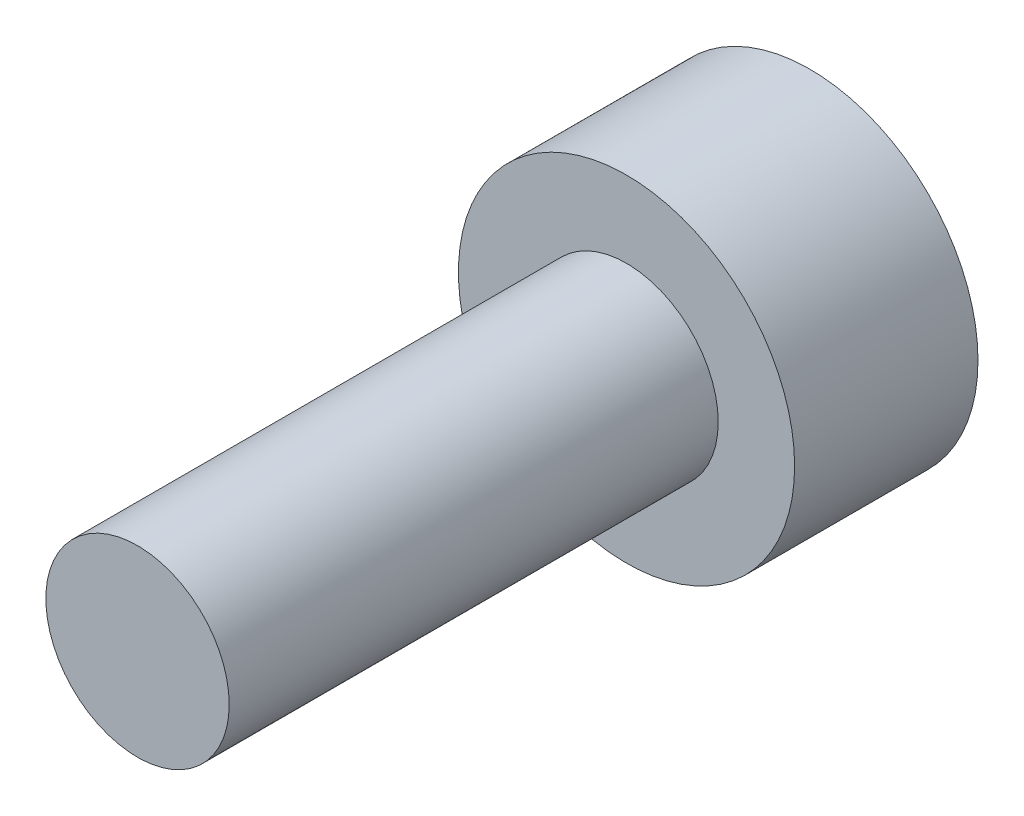
ISO-10303-21;
HEADER;
FILE_DESCRIPTION(('STEP AP214'),'2;1');
FILE_NAME('part.step','',(''),(''),'','','');
FILE_SCHEMA(('AUTOMOTIVE_DESIGN { 1 0 10303 214 1 1 1 1 }'));
ENDSEC;
DATA;
#1=APPLICATION_CONTEXT('core data for automotive mechanical design processes');
#2=APPLICATION_PROTOCOL_DEFINITION('international standard','automotive_design',2000,#1);
#3=PRODUCT_CONTEXT('',#1,'mechanical');
#4=PRODUCT('Part','Part','',(#3));
#5=PRODUCT_RELATED_PRODUCT_CATEGORY('part','',(#4));
#6=PRODUCT_DEFINITION_FORMATION('','',#4);
#7=PRODUCT_DEFINITION_CONTEXT('part definition',#1,'design');
#8=PRODUCT_DEFINITION('design','',#6,#7);
#9=PRODUCT_DEFINITION_SHAPE('','',#8);
#10=(LENGTH_UNIT() NAMED_UNIT(*) SI_UNIT(.MILLI.,.METRE.));
#11=(NAMED_UNIT(*) PLANE_ANGLE_UNIT() SI_UNIT($,.RADIAN.));
#12=(NAMED_UNIT(*) SI_UNIT($,.STERADIAN.) SOLID_ANGLE_UNIT());
#13=UNCERTAINTY_MEASURE_WITH_UNIT(LENGTH_MEASURE(1.E-05),#10,'distance_accuracy_value','');
#14=(GEOMETRIC_REPRESENTATION_CONTEXT(3) GLOBAL_UNCERTAINTY_ASSIGNED_CONTEXT((#13)) GLOBAL_UNIT_ASSIGNED_CONTEXT((#10,
#11,#12)) REPRESENTATION_CONTEXT('',''));
#15=CARTESIAN_POINT('',(0.,0.,0.));
#16=DIRECTION('',(0.,0.,1.));
#17=DIRECTION('',(1.,0.,0.));
#18=AXIS2_PLACEMENT_3D('',#15,#16,#17);
#19=CARTESIAN_POINT('',(0.,0.,-3.));
#20=DIRECTION('',(0.,0.,1.));
#21=DIRECTION('',(1.,0.,0.));
#22=AXIS2_PLACEMENT_3D('',#19,#20,#21);
#23=PLANE('',#22);
#24=CARTESIAN_POINT('',(0.,0.,-3.));
#25=DIRECTION('',(0.,0.,1.));
#26=DIRECTION('',(1.,0.,0.));
#27=AXIS2_PLACEMENT_3D('',#24,#25,#26);
#28=CIRCLE('',#27,2.75);
#29=CARTESIAN_POINT('',(2.75,0.,-3.));
#30=VERTEX_POINT('',#29);
#31=EDGE_CURVE('E47',#30,#30,#28,.T.);
#32=ORIENTED_EDGE('',*,*,#31,.F.);
#33=EDGE_LOOP('',(#32));
#34=FACE_BOUND('',#33,.T.);
#35=DIRECTION('',(0.5,0.866025403784439,0.));
#36=VECTOR('',#35,1.);
#37=CARTESIAN_POINT('',(0.721687836487032,-1.25,-3.));
#38=LINE('',#37,#36);
#39=CARTESIAN_POINT('',(0.721687836487032,-1.25,-3.));
#40=VERTEX_POINT('',#39);
#41=CARTESIAN_POINT('',(1.44337567297406,0.,-3.));
#42=VERTEX_POINT('',#41);
#43=EDGE_CURVE('E62',#40,#42,#38,.T.);
#44=ORIENTED_EDGE('',*,*,#43,.T.);
#45=DIRECTION('',(-0.5,0.866025403784439,0.));
#46=VECTOR('',#45,1.);
#47=CARTESIAN_POINT('',(1.44337567297406,0.,-3.));
#48=LINE('',#47,#46);
#49=CARTESIAN_POINT('',(0.721687836487032,1.25,-3.));
#50=VERTEX_POINT('',#49);
#51=EDGE_CURVE('E138',#42,#50,#48,.T.);
#52=ORIENTED_EDGE('',*,*,#51,.T.);
#53=DIRECTION('',(-1.,0.,0.));
#54=VECTOR('',#53,1.);
#55=CARTESIAN_POINT('',(0.721687836487032,1.25,-3.));
#56=LINE('',#55,#54);
#57=CARTESIAN_POINT('',(-0.721687836487032,1.25,-3.));
#58=VERTEX_POINT('',#57);
#59=EDGE_CURVE('E141',#50,#58,#56,.T.);
#60=ORIENTED_EDGE('',*,*,#59,.T.);
#61=DIRECTION('',(-0.5,-0.866025403784439,0.));
#62=VECTOR('',#61,1.);
#63=CARTESIAN_POINT('',(-0.721687836487032,1.25,-3.));
#64=LINE('',#63,#62);
#65=CARTESIAN_POINT('',(-1.44337567297406,0.,-3.));
#66=VERTEX_POINT('',#65);
#67=EDGE_CURVE('E150',#58,#66,#64,.T.);
#68=ORIENTED_EDGE('',*,*,#67,.T.);
#69=DIRECTION('',(0.5,-0.866025403784439,0.));
#70=VECTOR('',#69,1.);
#71=CARTESIAN_POINT('',(-1.44337567297406,0.,-3.));
#72=LINE('',#71,#70);
#73=CARTESIAN_POINT('',(-0.721687836487033,-1.25,-3.));
#74=VERTEX_POINT('',#73);
#75=EDGE_CURVE('E125',#66,#74,#72,.T.);
#76=ORIENTED_EDGE('',*,*,#75,.T.);
#77=DIRECTION('',(1.,0.,0.));
#78=VECTOR('',#77,1.);
#79=CARTESIAN_POINT('',(-0.721687836487033,-1.25,-3.));
#80=LINE('',#79,#78);
#81=EDGE_CURVE('E155',#74,#40,#80,.T.);
#82=ORIENTED_EDGE('',*,*,#81,.T.);
#83=EDGE_LOOP('',(#44,#52,#60,#68,#76,#82));
#84=FACE_BOUND('',#83,.T.);
#85=ADVANCED_FACE('F44',(#34,#84),#23,.F.);
#86=CARTESIAN_POINT('',(0.,0.,0.));
#87=DIRECTION('',(0.,0.,-1.));
#88=DIRECTION('',(-1.,0.,0.));
#89=AXIS2_PLACEMENT_3D('',#86,#87,#88);
#90=CYLINDRICAL_SURFACE('',#89,2.75);
#91=CARTESIAN_POINT('',(0.,0.,0.));
#92=DIRECTION('',(0.,0.,1.));
#93=DIRECTION('',(1.,0.,0.));
#94=AXIS2_PLACEMENT_3D('',#91,#92,#93);
#95=CIRCLE('',#94,2.75);
#96=CARTESIAN_POINT('',(2.75,0.,0.));
#97=VERTEX_POINT('',#96);
#98=EDGE_CURVE('E54',#97,#97,#95,.T.);
#99=ORIENTED_EDGE('',*,*,#98,.F.);
#100=EDGE_LOOP('',(#99));
#101=FACE_BOUND('',#100,.T.);
#102=ORIENTED_EDGE('',*,*,#31,.T.);
#103=EDGE_LOOP('',(#102));
#104=FACE_BOUND('',#103,.T.);
#105=ADVANCED_FACE('F50',(#101,#104),#90,.T.);
#106=CARTESIAN_POINT('',(0.,0.,0.));
#107=DIRECTION('',(0.,0.,1.));
#108=DIRECTION('',(1.,0.,0.));
#109=AXIS2_PLACEMENT_3D('',#106,#107,#108);
#110=PLANE('',#109);
#111=CARTESIAN_POINT('',(0.,0.,0.));
#112=DIRECTION('',(0.,0.,1.));
#113=DIRECTION('',(1.,0.,0.));
#114=AXIS2_PLACEMENT_3D('',#111,#112,#113);
#115=CIRCLE('',#114,1.5);
#116=CARTESIAN_POINT('',(1.5,0.,0.));
#117=VERTEX_POINT('',#116);
#118=EDGE_CURVE('E11',#117,#117,#115,.T.);
#119=ORIENTED_EDGE('',*,*,#118,.F.);
#120=EDGE_LOOP('',(#119));
#121=FACE_BOUND('',#120,.T.);
#122=ORIENTED_EDGE('',*,*,#98,.T.);
#123=EDGE_LOOP('',(#122));
#124=FACE_BOUND('',#123,.T.);
#125=ADVANCED_FACE('F212',(#121,#124),#110,.T.);
#126=CARTESIAN_POINT('',(0.,0.,8.));
#127=DIRECTION('',(0.,0.,-1.));
#128=DIRECTION('',(-1.,0.,0.));
#129=AXIS2_PLACEMENT_3D('',#126,#127,#128);
#130=CYLINDRICAL_SURFACE('',#129,1.5);
#131=CARTESIAN_POINT('',(0.,0.,8.));
#132=DIRECTION('',(0.,0.,1.));
#133=DIRECTION('',(1.,0.,0.));
#134=AXIS2_PLACEMENT_3D('',#131,#132,#133);
#135=CIRCLE('',#134,1.5);
#136=CARTESIAN_POINT('',(1.5,0.,8.));
#137=VERTEX_POINT('',#136);
#138=EDGE_CURVE('E166',#137,#137,#135,.T.);
#139=ORIENTED_EDGE('',*,*,#138,.F.);
#140=EDGE_LOOP('',(#139));
#141=FACE_BOUND('',#140,.T.);
#142=ORIENTED_EDGE('',*,*,#118,.T.);
#143=EDGE_LOOP('',(#142));
#144=FACE_BOUND('',#143,.T.);
#145=ADVANCED_FACE('F209',(#141,#144),#130,.T.);
#146=CARTESIAN_POINT('',(0.,0.,8.));
#147=DIRECTION('',(0.,0.,1.));
#148=DIRECTION('',(1.,0.,0.));
#149=AXIS2_PLACEMENT_3D('',#146,#147,#148);
#150=PLANE('',#149);
#151=ORIENTED_EDGE('',*,*,#138,.T.);
#152=EDGE_LOOP('',(#151));
#153=FACE_BOUND('',#152,.T.);
#154=ADVANCED_FACE('F204',(#153),#150,.T.);
#155=CARTESIAN_POINT('',(0.721687836487032,-1.25,-1.7));
#156=DIRECTION('',(-0.866025403784439,0.5,0.));
#157=DIRECTION('',(-0.5,-0.866025403784439,0.));
#158=AXIS2_PLACEMENT_3D('',#155,#156,#157);
#159=PLANE('',#158);
#160=ORIENTED_EDGE('',*,*,#43,.F.);
#161=DIRECTION('',(0.,0.,-1.));
#162=VECTOR('',#161,1.);
#163=CARTESIAN_POINT('',(0.721687836487032,-1.25,-1.7));
#164=LINE('',#163,#162);
#165=CARTESIAN_POINT('',(0.721687836487032,-1.25,-1.7));
#166=VERTEX_POINT('',#165);
#167=EDGE_CURVE('E132',#166,#40,#164,.T.);
#168=ORIENTED_EDGE('',*,*,#167,.F.);
#169=DIRECTION('',(0.5,0.866025403784439,0.));
#170=VECTOR('',#169,1.);
#171=CARTESIAN_POINT('',(0.721687836487032,-1.25,-1.7));
#172=LINE('',#171,#170);
#173=CARTESIAN_POINT('',(1.44337567297406,0.,-1.7));
#174=VERTEX_POINT('',#173);
#175=EDGE_CURVE('E156',#166,#174,#172,.T.);
#176=ORIENTED_EDGE('',*,*,#175,.T.);
#177=DIRECTION('',(0.,0.,-1.));
#178=VECTOR('',#177,1.);
#179=CARTESIAN_POINT('',(1.44337567297406,0.,-1.7));
#180=LINE('',#179,#178);
#181=EDGE_CURVE('E167',#174,#42,#180,.T.);
#182=ORIENTED_EDGE('',*,*,#181,.T.);
#183=EDGE_LOOP('',(#160,#168,#176,#182));
#184=FACE_BOUND('',#183,.T.);
#185=ADVANCED_FACE('F184',(#184),#159,.T.);
#186=CARTESIAN_POINT('',(1.44337567297406,0.,-1.7));
#187=DIRECTION('',(-0.866025403784439,-0.5,0.));
#188=DIRECTION('',(0.5,-0.866025403784439,0.));
#189=AXIS2_PLACEMENT_3D('',#186,#187,#188);
#190=PLANE('',#189);
#191=ORIENTED_EDGE('',*,*,#51,.F.);
#192=ORIENTED_EDGE('',*,*,#181,.F.);
#193=DIRECTION('',(-0.5,0.866025403784439,0.));
#194=VECTOR('',#193,1.);
#195=CARTESIAN_POINT('',(1.44337567297406,0.,-1.7));
#196=LINE('',#195,#194);
#197=CARTESIAN_POINT('',(0.721687836487032,1.25,-1.7));
#198=VERTEX_POINT('',#197);
#199=EDGE_CURVE('E105',#174,#198,#196,.T.);
#200=ORIENTED_EDGE('',*,*,#199,.T.);
#201=DIRECTION('',(0.,0.,-1.));
#202=VECTOR('',#201,1.);
#203=CARTESIAN_POINT('',(0.721687836487032,1.25,-1.7));
#204=LINE('',#203,#202);
#205=EDGE_CURVE('E162',#198,#50,#204,.T.);
#206=ORIENTED_EDGE('',*,*,#205,.T.);
#207=EDGE_LOOP('',(#191,#192,#200,#206));
#208=FACE_BOUND('',#207,.T.);
#209=ADVANCED_FACE('F198',(#208),#190,.T.);
#210=CARTESIAN_POINT('',(0.721687836487032,1.25,-1.7));
#211=DIRECTION('',(0.,-1.,0.));
#212=DIRECTION('',(1.,0.,0.));
#213=AXIS2_PLACEMENT_3D('',#210,#211,#212);
#214=PLANE('',#213);
#215=ORIENTED_EDGE('',*,*,#59,.F.);
#216=ORIENTED_EDGE('',*,*,#205,.F.);
#217=DIRECTION('',(-1.,0.,0.));
#218=VECTOR('',#217,1.);
#219=CARTESIAN_POINT('',(0.721687836487032,1.25,-1.7));
#220=LINE('',#219,#218);
#221=CARTESIAN_POINT('',(-0.721687836487032,1.25,-1.7));
#222=VERTEX_POINT('',#221);
#223=EDGE_CURVE('E121',#198,#222,#220,.T.);
#224=ORIENTED_EDGE('',*,*,#223,.T.);
#225=DIRECTION('',(0.,0.,-1.));
#226=VECTOR('',#225,1.);
#227=CARTESIAN_POINT('',(-0.721687836487032,1.25,-1.7));
#228=LINE('',#227,#226);
#229=EDGE_CURVE('E119',#222,#58,#228,.T.);
#230=ORIENTED_EDGE('',*,*,#229,.T.);
#231=EDGE_LOOP('',(#215,#216,#224,#230));
#232=FACE_BOUND('',#231,.T.);
#233=ADVANCED_FACE('F193',(#232),#214,.T.);
#234=CARTESIAN_POINT('',(-0.721687836487032,1.25,-1.7));
#235=DIRECTION('',(0.866025403784439,-0.5,0.));
#236=DIRECTION('',(0.5,0.866025403784439,0.));
#237=AXIS2_PLACEMENT_3D('',#234,#235,#236);
#238=PLANE('',#237);
#239=ORIENTED_EDGE('',*,*,#67,.F.);
#240=ORIENTED_EDGE('',*,*,#229,.F.);
#241=DIRECTION('',(-0.5,-0.866025403784439,0.));
#242=VECTOR('',#241,1.);
#243=CARTESIAN_POINT('',(-0.721687836487032,1.25,-1.7));
#244=LINE('',#243,#242);
#245=CARTESIAN_POINT('',(-1.44337567297406,0.,-1.7));
#246=VERTEX_POINT('',#245);
#247=EDGE_CURVE('E115',#222,#246,#244,.T.);
#248=ORIENTED_EDGE('',*,*,#247,.T.);
#249=DIRECTION('',(0.,0.,-1.));
#250=VECTOR('',#249,1.);
#251=CARTESIAN_POINT('',(-1.44337567297406,0.,-1.7));
#252=LINE('',#251,#250);
#253=EDGE_CURVE('E118',#246,#66,#252,.T.);
#254=ORIENTED_EDGE('',*,*,#253,.T.);
#255=EDGE_LOOP('',(#239,#240,#248,#254));
#256=FACE_BOUND('',#255,.T.);
#257=ADVANCED_FACE('F113',(#256),#238,.T.);
#258=CARTESIAN_POINT('',(-1.44337567297406,0.,-1.7));
#259=DIRECTION('',(0.866025403784439,0.5,0.));
#260=DIRECTION('',(-0.5,0.866025403784439,0.));
#261=AXIS2_PLACEMENT_3D('',#258,#259,#260);
#262=PLANE('',#261);
#263=ORIENTED_EDGE('',*,*,#75,.F.);
#264=ORIENTED_EDGE('',*,*,#253,.F.);
#265=DIRECTION('',(0.5,-0.866025403784439,0.));
#266=VECTOR('',#265,1.);
#267=CARTESIAN_POINT('',(-1.44337567297406,0.,-1.7));
#268=LINE('',#267,#266);
#269=CARTESIAN_POINT('',(-0.721687836487033,-1.25,-1.7));
#270=VERTEX_POINT('',#269);
#271=EDGE_CURVE('E116',#246,#270,#268,.T.);
#272=ORIENTED_EDGE('',*,*,#271,.T.);
#273=DIRECTION('',(0.,0.,-1.));
#274=VECTOR('',#273,1.);
#275=CARTESIAN_POINT('',(-0.721687836487033,-1.25,-1.7));
#276=LINE('',#275,#274);
#277=EDGE_CURVE('E91',#270,#74,#276,.T.);
#278=ORIENTED_EDGE('',*,*,#277,.T.);
#279=EDGE_LOOP('',(#263,#264,#272,#278));
#280=FACE_BOUND('',#279,.T.);
#281=ADVANCED_FACE('F124',(#280),#262,.T.);
#282=CARTESIAN_POINT('',(-0.721687836487033,-1.25,-1.7));
#283=DIRECTION('',(0.,1.,0.));
#284=DIRECTION('',(-1.,0.,0.));
#285=AXIS2_PLACEMENT_3D('',#282,#283,#284);
#286=PLANE('',#285);
#287=ORIENTED_EDGE('',*,*,#81,.F.);
#288=ORIENTED_EDGE('',*,*,#277,.F.);
#289=DIRECTION('',(1.,0.,0.));
#290=VECTOR('',#289,1.);
#291=CARTESIAN_POINT('',(-0.721687836487033,-1.25,-1.7));
#292=LINE('',#291,#290);
#293=EDGE_CURVE('E72',#270,#166,#292,.T.);
#294=ORIENTED_EDGE('',*,*,#293,.T.);
#295=ORIENTED_EDGE('',*,*,#167,.T.);
#296=EDGE_LOOP('',(#287,#288,#294,#295));
#297=FACE_BOUND('',#296,.T.);
#298=ADVANCED_FACE('F181',(#297),#286,.T.);
#299=CARTESIAN_POINT('',(0.,0.,-1.7));
#300=DIRECTION('',(0.,0.,1.));
#301=DIRECTION('',(1.,0.,0.));
#302=AXIS2_PLACEMENT_3D('',#299,#300,#301);
#303=PLANE('',#302);
#304=ORIENTED_EDGE('',*,*,#175,.F.);
#305=ORIENTED_EDGE('',*,*,#293,.F.);
#306=ORIENTED_EDGE('',*,*,#271,.F.);
#307=ORIENTED_EDGE('',*,*,#247,.F.);
#308=ORIENTED_EDGE('',*,*,#223,.F.);
#309=ORIENTED_EDGE('',*,*,#199,.F.);
#310=EDGE_LOOP('',(#304,#305,#306,#307,#308,#309));
#311=FACE_BOUND('',#310,.T.);
#312=ADVANCED_FACE('F129',(#311),#303,.F.);
#313=CLOSED_SHELL('',(#85,#105,#125,#145,#154,#185,#209,#233,#257,#281,#298,#312));
#314=MANIFOLD_SOLID_BREP('B2',#313);
#315=ADVANCED_BREP_SHAPE_REPRESENTATION('',(#18,#314),#14);
#316=SHAPE_DEFINITION_REPRESENTATION(#9,#315);
ENDSEC;
END-ISO-10303-21;
